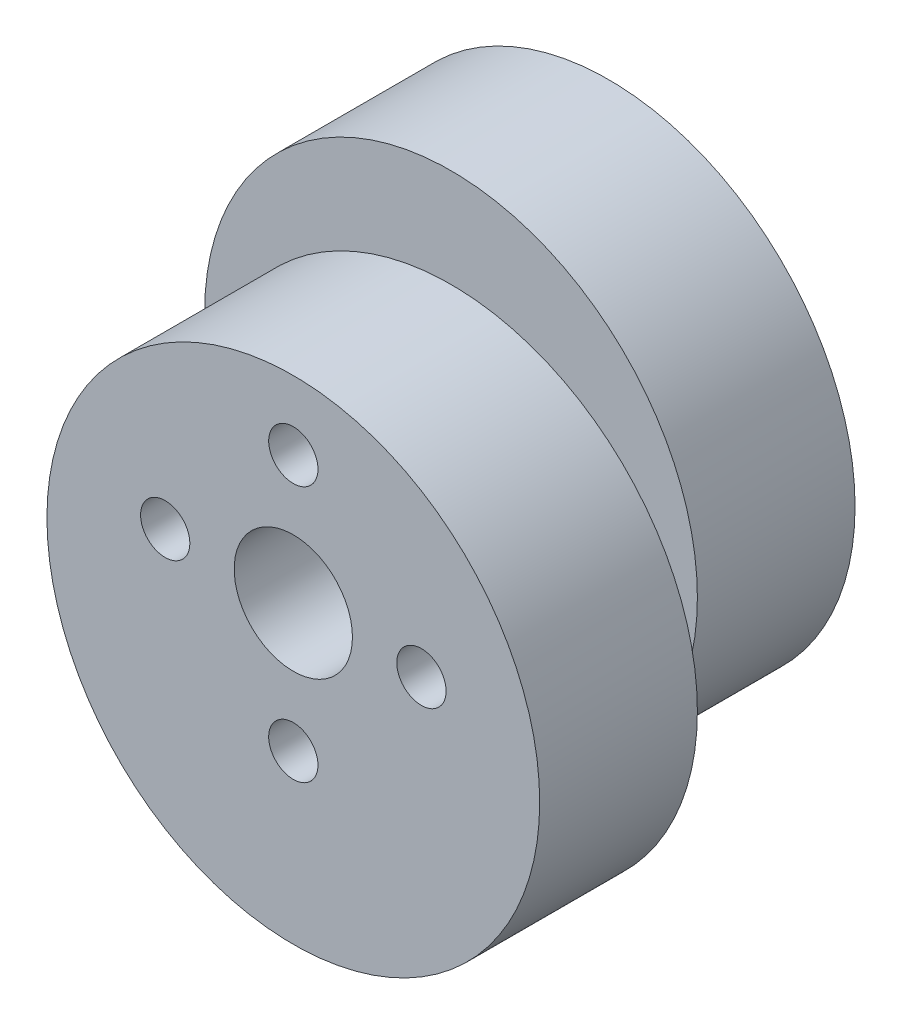
ISO-10303-21;
HEADER;
FILE_DESCRIPTION(('STEP AP214'),'2;1');
FILE_NAME('part.step','',(''),(''),'','','');
FILE_SCHEMA(('AUTOMOTIVE_DESIGN { 1 0 10303 214 1 1 1 1 }'));
ENDSEC;
DATA;
#1=APPLICATION_CONTEXT('core data for automotive mechanical design processes');
#2=APPLICATION_PROTOCOL_DEFINITION('international standard','automotive_design',2000,#1);
#3=PRODUCT_CONTEXT('',#1,'mechanical');
#4=PRODUCT('Part','Part','',(#3));
#5=PRODUCT_RELATED_PRODUCT_CATEGORY('part','',(#4));
#6=PRODUCT_DEFINITION_FORMATION('','',#4);
#7=PRODUCT_DEFINITION_CONTEXT('part definition',#1,'design');
#8=PRODUCT_DEFINITION('design','',#6,#7);
#9=PRODUCT_DEFINITION_SHAPE('','',#8);
#10=(LENGTH_UNIT() NAMED_UNIT(*) SI_UNIT(.MILLI.,.METRE.));
#11=(NAMED_UNIT(*) PLANE_ANGLE_UNIT() SI_UNIT($,.RADIAN.));
#12=(NAMED_UNIT(*) SI_UNIT($,.STERADIAN.) SOLID_ANGLE_UNIT());
#13=UNCERTAINTY_MEASURE_WITH_UNIT(LENGTH_MEASURE(1.E-05),#10,'distance_accuracy_value','');
#14=(GEOMETRIC_REPRESENTATION_CONTEXT(3) GLOBAL_UNCERTAINTY_ASSIGNED_CONTEXT((#13)) GLOBAL_UNIT_ASSIGNED_CONTEXT((#10,
#11,#12)) REPRESENTATION_CONTEXT('',''));
#15=CARTESIAN_POINT('',(0.,0.,0.));
#16=DIRECTION('',(0.,0.,1.));
#17=DIRECTION('',(1.,0.,0.));
#18=AXIS2_PLACEMENT_3D('',#15,#16,#17);
#19=CARTESIAN_POINT('',(0.,5.,-8.));
#20=DIRECTION('',(0.,0.,-1.));
#21=DIRECTION('',(-1.,0.,0.));
#22=AXIS2_PLACEMENT_3D('',#19,#20,#21);
#23=PLANE('',#22);
#24=CARTESIAN_POINT('',(6.5,2.5,-8.));
#25=DIRECTION('',(0.,0.,-1.));
#26=DIRECTION('',(-1.,0.,0.));
#27=AXIS2_PLACEMENT_3D('',#24,#25,#26);
#28=CIRCLE('',#27,1.25);
#29=CARTESIAN_POINT('',(5.25,2.5,-8.));
#30=VERTEX_POINT('',#29);
#31=EDGE_CURVE('E69',#30,#30,#28,.T.);
#32=ORIENTED_EDGE('',*,*,#31,.F.);
#33=EDGE_LOOP('',(#32));
#34=FACE_BOUND('',#33,.T.);
#35=CARTESIAN_POINT('',(-6.5,2.5,-8.));
#36=DIRECTION('',(0.,0.,-1.));
#37=DIRECTION('',(-1.,0.,0.));
#38=AXIS2_PLACEMENT_3D('',#35,#36,#37);
#39=CIRCLE('',#38,1.25);
#40=CARTESIAN_POINT('',(-7.75,2.5,-8.));
#41=VERTEX_POINT('',#40);
#42=EDGE_CURVE('E57',#41,#41,#39,.T.);
#43=ORIENTED_EDGE('',*,*,#42,.F.);
#44=EDGE_LOOP('',(#43));
#45=FACE_BOUND('',#44,.T.);
#46=CARTESIAN_POINT('',(0.,5.,-8.));
#47=DIRECTION('',(0.,0.,-1.));
#48=DIRECTION('',(-1.,0.,0.));
#49=AXIS2_PLACEMENT_3D('',#46,#47,#48);
#50=CIRCLE('',#49,12.5);
#51=CARTESIAN_POINT('',(-12.5,5.,-8.));
#52=VERTEX_POINT('',#51);
#53=EDGE_CURVE('E11',#52,#52,#50,.T.);
#54=ORIENTED_EDGE('',*,*,#53,.T.);
#55=EDGE_LOOP('',(#54));
#56=FACE_BOUND('',#55,.T.);
#57=CARTESIAN_POINT('',(0.,9.,-8.));
#58=DIRECTION('',(0.,0.,-1.));
#59=DIRECTION('',(-1.,0.,0.));
#60=AXIS2_PLACEMENT_3D('',#57,#58,#59);
#61=CIRCLE('',#60,1.25);
#62=CARTESIAN_POINT('',(-1.25,9.,-8.));
#63=VERTEX_POINT('',#62);
#64=EDGE_CURVE('E52',#63,#63,#61,.T.);
#65=ORIENTED_EDGE('',*,*,#64,.F.);
#66=EDGE_LOOP('',(#65));
#67=FACE_BOUND('',#66,.T.);
#68=CARTESIAN_POINT('',(0.,-4.,-8.));
#69=DIRECTION('',(0.,0.,-1.));
#70=DIRECTION('',(-1.,0.,0.));
#71=AXIS2_PLACEMENT_3D('',#68,#69,#70);
#72=CIRCLE('',#71,1.25);
#73=CARTESIAN_POINT('',(-1.25,-4.,-8.));
#74=VERTEX_POINT('',#73);
#75=EDGE_CURVE('E63',#74,#74,#72,.T.);
#76=ORIENTED_EDGE('',*,*,#75,.F.);
#77=EDGE_LOOP('',(#76));
#78=FACE_BOUND('',#77,.T.);
#79=CARTESIAN_POINT('',(0.,2.5,-8.));
#80=DIRECTION('',(0.,0.,-1.));
#81=DIRECTION('',(-1.,0.,0.));
#82=AXIS2_PLACEMENT_3D('',#79,#80,#81);
#83=CIRCLE('',#82,3.);
#84=CARTESIAN_POINT('',(-3.,2.5,-8.));
#85=VERTEX_POINT('',#84);
#86=EDGE_CURVE('E75',#85,#85,#83,.T.);
#87=ORIENTED_EDGE('',*,*,#86,.F.);
#88=EDGE_LOOP('',(#87));
#89=FACE_BOUND('',#88,.T.);
#90=ADVANCED_FACE('F41',(#34,#45,#56,#67,#78,#89),#23,.T.);
#91=CARTESIAN_POINT('',(0.,5.,0.));
#92=DIRECTION('',(0.,0.,-1.));
#93=DIRECTION('',(-1.,0.,0.));
#94=AXIS2_PLACEMENT_3D('',#91,#92,#93);
#95=PLANE('',#94);
#96=CARTESIAN_POINT('',(0.,5.,0.));
#97=DIRECTION('',(0.,0.,-1.));
#98=DIRECTION('',(-1.,0.,0.));
#99=AXIS2_PLACEMENT_3D('',#96,#97,#98);
#100=CIRCLE('',#99,12.5);
#101=CARTESIAN_POINT('',(-12.5,5.,0.));
#102=VERTEX_POINT('',#101);
#103=EDGE_CURVE('E45',#102,#102,#100,.T.);
#104=ORIENTED_EDGE('',*,*,#103,.F.);
#105=EDGE_LOOP('',(#104));
#106=FACE_BOUND('',#105,.T.);
#107=CARTESIAN_POINT('',(0.,9.,0.));
#108=DIRECTION('',(0.,0.,-1.));
#109=DIRECTION('',(-1.,0.,0.));
#110=AXIS2_PLACEMENT_3D('',#107,#108,#109);
#111=CIRCLE('',#110,1.25);
#112=CARTESIAN_POINT('',(-1.25,9.,0.));
#113=VERTEX_POINT('',#112);
#114=EDGE_CURVE('E54',#113,#113,#111,.T.);
#115=ORIENTED_EDGE('',*,*,#114,.T.);
#116=EDGE_LOOP('',(#115));
#117=FACE_BOUND('',#116,.T.);
#118=CARTESIAN_POINT('',(-6.5,2.5,0.));
#119=DIRECTION('',(0.,0.,-1.));
#120=DIRECTION('',(-1.,0.,0.));
#121=AXIS2_PLACEMENT_3D('',#118,#119,#120);
#122=CIRCLE('',#121,1.25);
#123=CARTESIAN_POINT('',(-7.75,2.5,0.));
#124=VERTEX_POINT('',#123);
#125=EDGE_CURVE('E60',#124,#124,#122,.T.);
#126=ORIENTED_EDGE('',*,*,#125,.T.);
#127=EDGE_LOOP('',(#126));
#128=FACE_BOUND('',#127,.T.);
#129=CARTESIAN_POINT('',(0.,-4.,0.));
#130=DIRECTION('',(0.,0.,-1.));
#131=DIRECTION('',(-1.,0.,0.));
#132=AXIS2_PLACEMENT_3D('',#129,#130,#131);
#133=CIRCLE('',#132,1.25);
#134=CARTESIAN_POINT('',(-1.25,-4.,0.));
#135=VERTEX_POINT('',#134);
#136=EDGE_CURVE('E66',#135,#135,#133,.T.);
#137=ORIENTED_EDGE('',*,*,#136,.T.);
#138=EDGE_LOOP('',(#137));
#139=FACE_BOUND('',#138,.T.);
#140=CARTESIAN_POINT('',(6.5,2.5,0.));
#141=DIRECTION('',(0.,0.,-1.));
#142=DIRECTION('',(-1.,0.,0.));
#143=AXIS2_PLACEMENT_3D('',#140,#141,#142);
#144=CIRCLE('',#143,1.25);
#145=CARTESIAN_POINT('',(5.25,2.5,0.));
#146=VERTEX_POINT('',#145);
#147=EDGE_CURVE('E72',#146,#146,#144,.T.);
#148=ORIENTED_EDGE('',*,*,#147,.T.);
#149=EDGE_LOOP('',(#148));
#150=FACE_BOUND('',#149,.T.);
#151=CARTESIAN_POINT('',(0.,2.5,0.));
#152=DIRECTION('',(0.,0.,-1.));
#153=DIRECTION('',(-1.,0.,0.));
#154=AXIS2_PLACEMENT_3D('',#151,#152,#153);
#155=CIRCLE('',#154,3.);
#156=CARTESIAN_POINT('',(-3.,2.5,0.));
#157=VERTEX_POINT('',#156);
#158=EDGE_CURVE('E78',#157,#157,#155,.T.);
#159=ORIENTED_EDGE('',*,*,#158,.T.);
#160=EDGE_LOOP('',(#159));
#161=FACE_BOUND('',#160,.T.);
#162=ADVANCED_FACE('F88',(#106,#117,#128,#139,#150,#161),#95,.F.);
#163=CARTESIAN_POINT('',(0.,5.,-8.));
#164=DIRECTION('',(0.,0.,1.));
#165=DIRECTION('',(1.,0.,0.));
#166=AXIS2_PLACEMENT_3D('',#163,#164,#165);
#167=CYLINDRICAL_SURFACE('',#166,12.5);
#168=ORIENTED_EDGE('',*,*,#53,.F.);
#169=EDGE_LOOP('',(#168));
#170=FACE_BOUND('',#169,.T.);
#171=ORIENTED_EDGE('',*,*,#103,.T.);
#172=EDGE_LOOP('',(#171));
#173=FACE_BOUND('',#172,.T.);
#174=ADVANCED_FACE('F43',(#170,#173),#167,.T.);
#175=CARTESIAN_POINT('',(0.,9.,-8.));
#176=DIRECTION('',(0.,0.,1.));
#177=DIRECTION('',(1.,0.,0.));
#178=AXIS2_PLACEMENT_3D('',#175,#176,#177);
#179=CYLINDRICAL_SURFACE('',#178,1.25);
#180=ORIENTED_EDGE('',*,*,#64,.T.);
#181=EDGE_LOOP('',(#180));
#182=FACE_BOUND('',#181,.T.);
#183=ORIENTED_EDGE('',*,*,#114,.F.);
#184=EDGE_LOOP('',(#183));
#185=FACE_BOUND('',#184,.T.);
#186=ADVANCED_FACE('F98',(#182,#185),#179,.F.);
#187=CARTESIAN_POINT('',(-6.5,2.5,-8.));
#188=DIRECTION('',(0.,0.,1.));
#189=DIRECTION('',(1.,0.,0.));
#190=AXIS2_PLACEMENT_3D('',#187,#188,#189);
#191=CYLINDRICAL_SURFACE('',#190,1.25);
#192=ORIENTED_EDGE('',*,*,#42,.T.);
#193=EDGE_LOOP('',(#192));
#194=FACE_BOUND('',#193,.T.);
#195=ORIENTED_EDGE('',*,*,#125,.F.);
#196=EDGE_LOOP('',(#195));
#197=FACE_BOUND('',#196,.T.);
#198=ADVANCED_FACE('F101',(#194,#197),#191,.F.);
#199=CARTESIAN_POINT('',(0.,-4.,-8.));
#200=DIRECTION('',(0.,0.,1.));
#201=DIRECTION('',(1.,0.,0.));
#202=AXIS2_PLACEMENT_3D('',#199,#200,#201);
#203=CYLINDRICAL_SURFACE('',#202,1.25);
#204=ORIENTED_EDGE('',*,*,#75,.T.);
#205=EDGE_LOOP('',(#204));
#206=FACE_BOUND('',#205,.T.);
#207=ORIENTED_EDGE('',*,*,#136,.F.);
#208=EDGE_LOOP('',(#207));
#209=FACE_BOUND('',#208,.T.);
#210=ADVANCED_FACE('F105',(#206,#209),#203,.F.);
#211=CARTESIAN_POINT('',(6.5,2.5,-8.));
#212=DIRECTION('',(0.,0.,1.));
#213=DIRECTION('',(1.,0.,0.));
#214=AXIS2_PLACEMENT_3D('',#211,#212,#213);
#215=CYLINDRICAL_SURFACE('',#214,1.25);
#216=ORIENTED_EDGE('',*,*,#31,.T.);
#217=EDGE_LOOP('',(#216));
#218=FACE_BOUND('',#217,.T.);
#219=ORIENTED_EDGE('',*,*,#147,.F.);
#220=EDGE_LOOP('',(#219));
#221=FACE_BOUND('',#220,.T.);
#222=ADVANCED_FACE('F109',(#218,#221),#215,.F.);
#223=CARTESIAN_POINT('',(0.,2.5,-8.));
#224=DIRECTION('',(0.,0.,1.));
#225=DIRECTION('',(1.,0.,0.));
#226=AXIS2_PLACEMENT_3D('',#223,#224,#225);
#227=CYLINDRICAL_SURFACE('',#226,3.);
#228=ORIENTED_EDGE('',*,*,#86,.T.);
#229=EDGE_LOOP('',(#228));
#230=FACE_BOUND('',#229,.T.);
#231=ORIENTED_EDGE('',*,*,#158,.F.);
#232=EDGE_LOOP('',(#231));
#233=FACE_BOUND('',#232,.T.);
#234=ADVANCED_FACE('F84',(#230,#233),#227,.F.);
#235=CLOSED_SHELL('',(#90,#162,#174,#186,#198,#210,#222,#234));
#236=MANIFOLD_SOLID_BREP('B2',#235);
#237=CARTESIAN_POINT('',(0.,0.,8.));
#238=DIRECTION('',(0.,0.,1.));
#239=DIRECTION('',(1.,0.,0.));
#240=AXIS2_PLACEMENT_3D('',#237,#238,#239);
#241=PLANE('',#240);
#242=CARTESIAN_POINT('',(0.,9.,8.));
#243=DIRECTION('',(0.,0.,1.));
#244=DIRECTION('',(1.,0.,0.));
#245=AXIS2_PLACEMENT_3D('',#242,#243,#244);
#246=CIRCLE('',#245,1.25);
#247=CARTESIAN_POINT('',(1.25,9.,8.));
#248=VERTEX_POINT('',#247);
#249=EDGE_CURVE('E215',#248,#248,#246,.T.);
#250=ORIENTED_EDGE('',*,*,#249,.F.);
#251=EDGE_LOOP('',(#250));
#252=FACE_BOUND('',#251,.T.);
#253=CARTESIAN_POINT('',(0.,2.5,8.));
#254=DIRECTION('',(0.,0.,1.));
#255=DIRECTION('',(1.,0.,0.));
#256=AXIS2_PLACEMENT_3D('',#253,#254,#255);
#257=CIRCLE('',#256,3.);
#258=CARTESIAN_POINT('',(3.,2.5,8.));
#259=VERTEX_POINT('',#258);
#260=EDGE_CURVE('E203',#259,#259,#257,.T.);
#261=ORIENTED_EDGE('',*,*,#260,.F.);
#262=EDGE_LOOP('',(#261));
#263=FACE_BOUND('',#262,.T.);
#264=CARTESIAN_POINT('',(0.,0.,8.));
#265=DIRECTION('',(0.,0.,1.));
#266=DIRECTION('',(1.,0.,0.));
#267=AXIS2_PLACEMENT_3D('',#264,#265,#266);
#268=CIRCLE('',#267,12.5);
#269=CARTESIAN_POINT('',(12.5,0.,8.));
#270=VERTEX_POINT('',#269);
#271=EDGE_CURVE('E40',#270,#270,#268,.T.);
#272=ORIENTED_EDGE('',*,*,#271,.T.);
#273=EDGE_LOOP('',(#272));
#274=FACE_BOUND('',#273,.T.);
#275=CARTESIAN_POINT('',(0.,-4.,8.));
#276=DIRECTION('',(0.,0.,1.));
#277=DIRECTION('',(1.,0.,0.));
#278=AXIS2_PLACEMENT_3D('',#275,#276,#277);
#279=CIRCLE('',#278,1.25);
#280=CARTESIAN_POINT('',(1.25,-4.,8.));
#281=VERTEX_POINT('',#280);
#282=EDGE_CURVE('E198',#281,#281,#279,.T.);
#283=ORIENTED_EDGE('',*,*,#282,.F.);
#284=EDGE_LOOP('',(#283));
#285=FACE_BOUND('',#284,.T.);
#286=CARTESIAN_POINT('',(-6.5,2.5,8.));
#287=DIRECTION('',(0.,0.,1.));
#288=DIRECTION('',(1.,0.,0.));
#289=AXIS2_PLACEMENT_3D('',#286,#287,#288);
#290=CIRCLE('',#289,1.25);
#291=CARTESIAN_POINT('',(-5.25,2.5,8.));
#292=VERTEX_POINT('',#291);
#293=EDGE_CURVE('E209',#292,#292,#290,.T.);
#294=ORIENTED_EDGE('',*,*,#293,.F.);
#295=EDGE_LOOP('',(#294));
#296=FACE_BOUND('',#295,.T.);
#297=CARTESIAN_POINT('',(6.5,2.5,8.));
#298=DIRECTION('',(0.,0.,1.));
#299=DIRECTION('',(1.,0.,0.));
#300=AXIS2_PLACEMENT_3D('',#297,#298,#299);
#301=CIRCLE('',#300,1.25);
#302=CARTESIAN_POINT('',(7.75,2.5,8.));
#303=VERTEX_POINT('',#302);
#304=EDGE_CURVE('E221',#303,#303,#301,.T.);
#305=ORIENTED_EDGE('',*,*,#304,.F.);
#306=EDGE_LOOP('',(#305));
#307=FACE_BOUND('',#306,.T.);
#308=ADVANCED_FACE('F187',(#252,#263,#274,#285,#296,#307),#241,.T.);
#309=CARTESIAN_POINT('',(0.,0.,0.));
#310=DIRECTION('',(0.,0.,1.));
#311=DIRECTION('',(1.,0.,0.));
#312=AXIS2_PLACEMENT_3D('',#309,#310,#311);
#313=PLANE('',#312);
#314=CARTESIAN_POINT('',(0.,0.,0.));
#315=DIRECTION('',(0.,0.,1.));
#316=DIRECTION('',(1.,0.,0.));
#317=AXIS2_PLACEMENT_3D('',#314,#315,#316);
#318=CIRCLE('',#317,12.5);
#319=CARTESIAN_POINT('',(12.5,0.,0.));
#320=VERTEX_POINT('',#319);
#321=EDGE_CURVE('E191',#320,#320,#318,.T.);
#322=ORIENTED_EDGE('',*,*,#321,.F.);
#323=EDGE_LOOP('',(#322));
#324=FACE_BOUND('',#323,.T.);
#325=CARTESIAN_POINT('',(0.,-4.,0.));
#326=DIRECTION('',(0.,0.,1.));
#327=DIRECTION('',(1.,0.,0.));
#328=AXIS2_PLACEMENT_3D('',#325,#326,#327);
#329=CIRCLE('',#328,1.25);
#330=CARTESIAN_POINT('',(1.25,-4.,0.));
#331=VERTEX_POINT('',#330);
#332=EDGE_CURVE('E200',#331,#331,#329,.T.);
#333=ORIENTED_EDGE('',*,*,#332,.T.);
#334=EDGE_LOOP('',(#333));
#335=FACE_BOUND('',#334,.T.);
#336=CARTESIAN_POINT('',(0.,2.5,0.));
#337=DIRECTION('',(0.,0.,1.));
#338=DIRECTION('',(1.,0.,0.));
#339=AXIS2_PLACEMENT_3D('',#336,#337,#338);
#340=CIRCLE('',#339,3.);
#341=CARTESIAN_POINT('',(3.,2.5,0.));
#342=VERTEX_POINT('',#341);
#343=EDGE_CURVE('E206',#342,#342,#340,.T.);
#344=ORIENTED_EDGE('',*,*,#343,.T.);
#345=EDGE_LOOP('',(#344));
#346=FACE_BOUND('',#345,.T.);
#347=CARTESIAN_POINT('',(-6.5,2.5,0.));
#348=DIRECTION('',(0.,0.,1.));
#349=DIRECTION('',(1.,0.,0.));
#350=AXIS2_PLACEMENT_3D('',#347,#348,#349);
#351=CIRCLE('',#350,1.25);
#352=CARTESIAN_POINT('',(-5.25,2.5,0.));
#353=VERTEX_POINT('',#352);
#354=EDGE_CURVE('E212',#353,#353,#351,.T.);
#355=ORIENTED_EDGE('',*,*,#354,.T.);
#356=EDGE_LOOP('',(#355));
#357=FACE_BOUND('',#356,.T.);
#358=CARTESIAN_POINT('',(0.,9.,0.));
#359=DIRECTION('',(0.,0.,1.));
#360=DIRECTION('',(1.,0.,0.));
#361=AXIS2_PLACEMENT_3D('',#358,#359,#360);
#362=CIRCLE('',#361,1.25);
#363=CARTESIAN_POINT('',(1.25,9.,0.));
#364=VERTEX_POINT('',#363);
#365=EDGE_CURVE('E218',#364,#364,#362,.T.);
#366=ORIENTED_EDGE('',*,*,#365,.T.);
#367=EDGE_LOOP('',(#366));
#368=FACE_BOUND('',#367,.T.);
#369=CARTESIAN_POINT('',(6.5,2.5,0.));
#370=DIRECTION('',(0.,0.,1.));
#371=DIRECTION('',(1.,0.,0.));
#372=AXIS2_PLACEMENT_3D('',#369,#370,#371);
#373=CIRCLE('',#372,1.25);
#374=CARTESIAN_POINT('',(7.75,2.5,0.));
#375=VERTEX_POINT('',#374);
#376=EDGE_CURVE('E224',#375,#375,#373,.T.);
#377=ORIENTED_EDGE('',*,*,#376,.T.);
#378=EDGE_LOOP('',(#377));
#379=FACE_BOUND('',#378,.T.);
#380=ADVANCED_FACE('F234',(#324,#335,#346,#357,#368,#379),#313,.F.);
#381=CARTESIAN_POINT('',(0.,0.,8.));
#382=DIRECTION('',(0.,0.,-1.));
#383=DIRECTION('',(-1.,0.,0.));
#384=AXIS2_PLACEMENT_3D('',#381,#382,#383);
#385=CYLINDRICAL_SURFACE('',#384,12.5);
#386=ORIENTED_EDGE('',*,*,#271,.F.);
#387=EDGE_LOOP('',(#386));
#388=FACE_BOUND('',#387,.T.);
#389=ORIENTED_EDGE('',*,*,#321,.T.);
#390=EDGE_LOOP('',(#389));
#391=FACE_BOUND('',#390,.T.);
#392=ADVANCED_FACE('F189',(#388,#391),#385,.T.);
#393=CARTESIAN_POINT('',(0.,-4.,8.));
#394=DIRECTION('',(0.,0.,-1.));
#395=DIRECTION('',(-1.,0.,0.));
#396=AXIS2_PLACEMENT_3D('',#393,#394,#395);
#397=CYLINDRICAL_SURFACE('',#396,1.25);
#398=ORIENTED_EDGE('',*,*,#282,.T.);
#399=EDGE_LOOP('',(#398));
#400=FACE_BOUND('',#399,.T.);
#401=ORIENTED_EDGE('',*,*,#332,.F.);
#402=EDGE_LOOP('',(#401));
#403=FACE_BOUND('',#402,.T.);
#404=ADVANCED_FACE('F244',(#400,#403),#397,.F.);
#405=CARTESIAN_POINT('',(0.,2.5,8.));
#406=DIRECTION('',(0.,0.,-1.));
#407=DIRECTION('',(-1.,0.,0.));
#408=AXIS2_PLACEMENT_3D('',#405,#406,#407);
#409=CYLINDRICAL_SURFACE('',#408,3.);
#410=ORIENTED_EDGE('',*,*,#260,.T.);
#411=EDGE_LOOP('',(#410));
#412=FACE_BOUND('',#411,.T.);
#413=ORIENTED_EDGE('',*,*,#343,.F.);
#414=EDGE_LOOP('',(#413));
#415=FACE_BOUND('',#414,.T.);
#416=ADVANCED_FACE('F247',(#412,#415),#409,.F.);
#417=CARTESIAN_POINT('',(-6.5,2.5,8.));
#418=DIRECTION('',(0.,0.,-1.));
#419=DIRECTION('',(-1.,0.,0.));
#420=AXIS2_PLACEMENT_3D('',#417,#418,#419);
#421=CYLINDRICAL_SURFACE('',#420,1.25);
#422=ORIENTED_EDGE('',*,*,#293,.T.);
#423=EDGE_LOOP('',(#422));
#424=FACE_BOUND('',#423,.T.);
#425=ORIENTED_EDGE('',*,*,#354,.F.);
#426=EDGE_LOOP('',(#425));
#427=FACE_BOUND('',#426,.T.);
#428=ADVANCED_FACE('F251',(#424,#427),#421,.F.);
#429=CARTESIAN_POINT('',(0.,9.,8.));
#430=DIRECTION('',(0.,0.,-1.));
#431=DIRECTION('',(-1.,0.,0.));
#432=AXIS2_PLACEMENT_3D('',#429,#430,#431);
#433=CYLINDRICAL_SURFACE('',#432,1.25);
#434=ORIENTED_EDGE('',*,*,#249,.T.);
#435=EDGE_LOOP('',(#434));
#436=FACE_BOUND('',#435,.T.);
#437=ORIENTED_EDGE('',*,*,#365,.F.);
#438=EDGE_LOOP('',(#437));
#439=FACE_BOUND('',#438,.T.);
#440=ADVANCED_FACE('F255',(#436,#439),#433,.F.);
#441=CARTESIAN_POINT('',(6.5,2.5,8.));
#442=DIRECTION('',(0.,0.,-1.));
#443=DIRECTION('',(-1.,0.,0.));
#444=AXIS2_PLACEMENT_3D('',#441,#442,#443);
#445=CYLINDRICAL_SURFACE('',#444,1.25);
#446=ORIENTED_EDGE('',*,*,#304,.T.);
#447=EDGE_LOOP('',(#446));
#448=FACE_BOUND('',#447,.T.);
#449=ORIENTED_EDGE('',*,*,#376,.F.);
#450=EDGE_LOOP('',(#449));
#451=FACE_BOUND('',#450,.T.);
#452=ADVANCED_FACE('F230',(#448,#451),#445,.F.);
#453=CLOSED_SHELL('',(#308,#380,#392,#404,#416,#428,#440,#452));
#454=MANIFOLD_SOLID_BREP('B6',#453);
#455=ADVANCED_BREP_SHAPE_REPRESENTATION('',(#18,#236,#454),#14);
#456=SHAPE_DEFINITION_REPRESENTATION(#9,#455);
ENDSEC;
END-ISO-10303-21;
